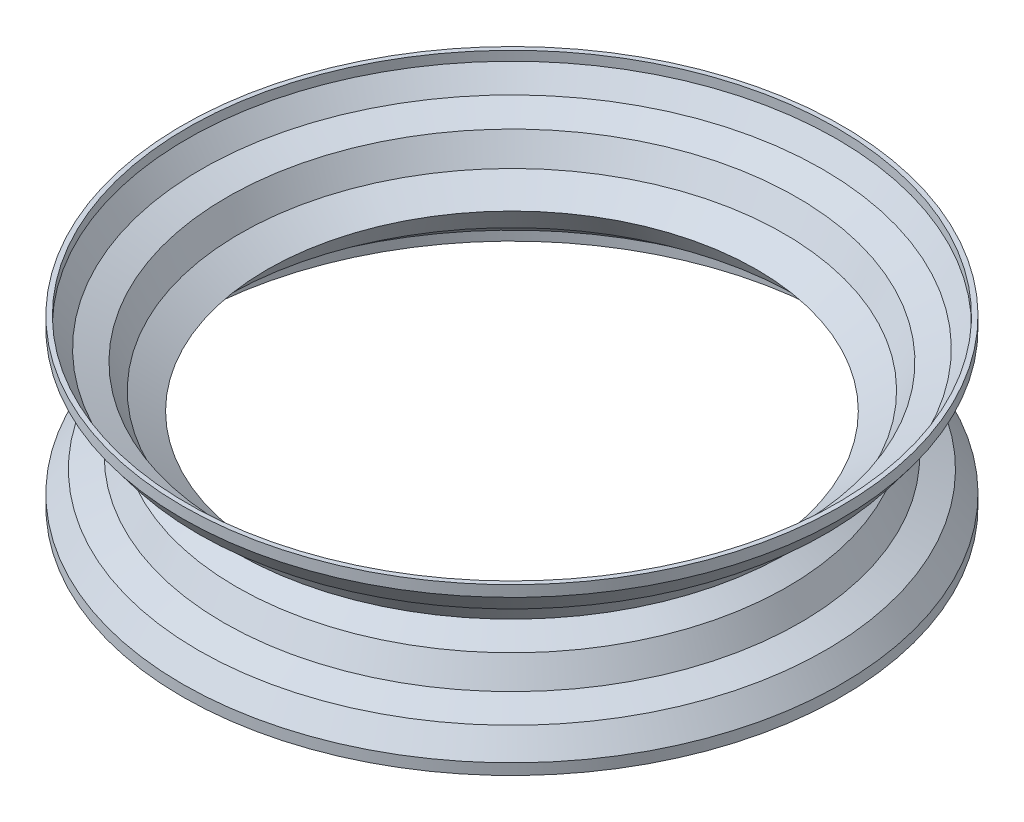
ISO-10303-21;
HEADER;
FILE_DESCRIPTION(('STEP AP214'),'2;1');
FILE_NAME('part.step','',(''),(''),'','','');
FILE_SCHEMA(('AUTOMOTIVE_DESIGN { 1 0 10303 214 1 1 1 1 }'));
ENDSEC;
DATA;
#1=APPLICATION_CONTEXT('core data for automotive mechanical design processes');
#2=APPLICATION_PROTOCOL_DEFINITION('international standard','automotive_design',2000,#1);
#3=PRODUCT_CONTEXT('',#1,'mechanical');
#4=PRODUCT('Part','Part','',(#3));
#5=PRODUCT_RELATED_PRODUCT_CATEGORY('part','',(#4));
#6=PRODUCT_DEFINITION_FORMATION('','',#4);
#7=PRODUCT_DEFINITION_CONTEXT('part definition',#1,'design');
#8=PRODUCT_DEFINITION('design','',#6,#7);
#9=PRODUCT_DEFINITION_SHAPE('','',#8);
#10=(LENGTH_UNIT() NAMED_UNIT(*) SI_UNIT(.MILLI.,.METRE.));
#11=(NAMED_UNIT(*) PLANE_ANGLE_UNIT() SI_UNIT($,.RADIAN.));
#12=(NAMED_UNIT(*) SI_UNIT($,.STERADIAN.) SOLID_ANGLE_UNIT());
#13=UNCERTAINTY_MEASURE_WITH_UNIT(LENGTH_MEASURE(1.E-05),#10,'distance_accuracy_value','');
#14=(GEOMETRIC_REPRESENTATION_CONTEXT(3) GLOBAL_UNCERTAINTY_ASSIGNED_CONTEXT((#13)) GLOBAL_UNIT_ASSIGNED_CONTEXT((#10,
#11,#12)) REPRESENTATION_CONTEXT('',''));
#15=CARTESIAN_POINT('',(0.,0.,0.));
#16=DIRECTION('',(0.,0.,1.));
#17=DIRECTION('',(1.,0.,0.));
#18=AXIS2_PLACEMENT_3D('',#15,#16,#17);
#19=CARTESIAN_POINT('',(0.,1.2,0.));
#20=DIRECTION('',(0.,-1.,0.));
#21=DIRECTION('',(0.,0.,-1.));
#22=AXIS2_PLACEMENT_3D('',#19,#20,#21);
#23=CYLINDRICAL_SURFACE('',#22,35.8938037049019);
#24=CARTESIAN_POINT('',(0.,1.2,0.));
#25=DIRECTION('',(0.,1.,0.));
#26=DIRECTION('',(0.,0.,1.));
#27=AXIS2_PLACEMENT_3D('',#24,#25,#26);
#28=CIRCLE('',#27,35.8938037049019);
#29=CARTESIAN_POINT('',(0.,1.2,35.8938037049019));
#30=VERTEX_POINT('',#29);
#31=EDGE_CURVE('E10',#30,#30,#28,.T.);
#32=ORIENTED_EDGE('',*,*,#31,.F.);
#33=EDGE_LOOP('',(#32));
#34=FACE_BOUND('',#33,.T.);
#35=CARTESIAN_POINT('',(0.,0.,0.));
#36=DIRECTION('',(0.,1.,0.));
#37=DIRECTION('',(0.,0.,1.));
#38=AXIS2_PLACEMENT_3D('',#35,#36,#37);
#39=CIRCLE('',#38,35.8938037049019);
#40=CARTESIAN_POINT('',(0.,0.,35.8938037049019));
#41=VERTEX_POINT('',#40);
#42=EDGE_CURVE('E40',#41,#41,#39,.T.);
#43=ORIENTED_EDGE('',*,*,#42,.T.);
#44=EDGE_LOOP('',(#43));
#45=FACE_BOUND('',#44,.T.);
#46=ADVANCED_FACE('F37',(#34,#45),#23,.T.);
#47=CARTESIAN_POINT('',(0.,0.,0.));
#48=DIRECTION('',(0.,1.,0.));
#49=DIRECTION('',(0.,0.,1.));
#50=AXIS2_PLACEMENT_3D('',#47,#48,#49);
#51=PLANE('',#50);
#52=CARTESIAN_POINT('',(0.,0.,0.));
#53=DIRECTION('',(0.,1.,0.));
#54=DIRECTION('',(0.,0.,1.));
#55=AXIS2_PLACEMENT_3D('',#52,#53,#54);
#56=CIRCLE('',#55,35.3938037049019);
#57=CARTESIAN_POINT('',(0.,0.,35.3938037049019));
#58=VERTEX_POINT('',#57);
#59=EDGE_CURVE('E93',#58,#58,#56,.T.);
#60=ORIENTED_EDGE('',*,*,#59,.T.);
#61=EDGE_LOOP('',(#60));
#62=FACE_BOUND('',#61,.T.);
#63=ORIENTED_EDGE('',*,*,#42,.F.);
#64=EDGE_LOOP('',(#63));
#65=FACE_BOUND('',#64,.T.);
#66=ADVANCED_FACE('F172',(#62,#65),#51,.F.);
#67=CARTESIAN_POINT('',(0.,3.51446172217943,0.));
#68=DIRECTION('',(0.,-1.,0.));
#69=DIRECTION('',(0.,0.,-1.));
#70=AXIS2_PLACEMENT_3D('',#67,#68,#69);
#71=CONICAL_SURFACE('',#70,34.1598368592887,0.642981197678177);
#72=ORIENTED_EDGE('',*,*,#31,.T.);
#73=EDGE_LOOP('',(#72));
#74=FACE_BOUND('',#73,.T.);
#75=CARTESIAN_POINT('',(0.,3.51446172217943,0.));
#76=DIRECTION('',(0.,1.,0.));
#77=DIRECTION('',(0.,0.,1.));
#78=AXIS2_PLACEMENT_3D('',#75,#76,#77);
#79=CIRCLE('',#78,34.1598368592887);
#80=CARTESIAN_POINT('',(0.,3.51446172217943,34.1598368592887));
#81=VERTEX_POINT('',#80);
#82=EDGE_CURVE('E49',#81,#81,#79,.T.);
#83=ORIENTED_EDGE('',*,*,#82,.F.);
#84=EDGE_LOOP('',(#83));
#85=FACE_BOUND('',#84,.T.);
#86=ADVANCED_FACE('F177',(#74,#85),#71,.T.);
#87=CARTESIAN_POINT('',(0.,4.73553827782057,0.));
#88=DIRECTION('',(0.,-1.,0.));
#89=DIRECTION('',(0.,0.,-1.));
#90=AXIS2_PLACEMENT_3D('',#87,#88,#89);
#91=CONICAL_SURFACE('',#90,31.3989771869434,1.15437979863592);
#92=ORIENTED_EDGE('',*,*,#82,.T.);
#93=EDGE_LOOP('',(#92));
#94=FACE_BOUND('',#93,.T.);
#95=CARTESIAN_POINT('',(0.,4.73553827782057,0.));
#96=DIRECTION('',(0.,1.,0.));
#97=DIRECTION('',(0.,0.,1.));
#98=AXIS2_PLACEMENT_3D('',#95,#96,#97);
#99=CIRCLE('',#98,31.3989771869434);
#100=CARTESIAN_POINT('',(0.,4.73553827782057,31.3989771869434));
#101=VERTEX_POINT('',#100);
#102=EDGE_CURVE('E54',#101,#101,#99,.T.);
#103=ORIENTED_EDGE('',*,*,#102,.F.);
#104=EDGE_LOOP('',(#103));
#105=FACE_BOUND('',#104,.T.);
#106=ADVANCED_FACE('F185',(#94,#105),#91,.T.);
#107=CARTESIAN_POINT('',(0.,7.41446172217942,0.));
#108=DIRECTION('',(0.,-1.,0.));
#109=DIRECTION('',(0.,0.,-1.));
#110=AXIS2_PLACEMENT_3D('',#107,#108,#109);
#111=CONICAL_SURFACE('',#110,30.0073079502409,0.47911637724037);
#112=ORIENTED_EDGE('',*,*,#102,.T.);
#113=EDGE_LOOP('',(#112));
#114=FACE_BOUND('',#113,.T.);
#115=CARTESIAN_POINT('',(0.,7.41446172217942,0.));
#116=DIRECTION('',(0.,1.,0.));
#117=DIRECTION('',(0.,0.,1.));
#118=AXIS2_PLACEMENT_3D('',#115,#116,#117);
#119=CIRCLE('',#118,30.0073079502409);
#120=CARTESIAN_POINT('',(0.,7.41446172217942,30.0073079502409));
#121=VERTEX_POINT('',#120);
#122=EDGE_CURVE('E58',#121,#121,#119,.T.);
#123=ORIENTED_EDGE('',*,*,#122,.F.);
#124=EDGE_LOOP('',(#123));
#125=FACE_BOUND('',#124,.T.);
#126=ADVANCED_FACE('F190',(#114,#125),#111,.T.);
#127=CARTESIAN_POINT('',(0.,9.,0.));
#128=DIRECTION('',(0.,-1.,0.));
#129=DIRECTION('',(0.,0.,-1.));
#130=AXIS2_PLACEMENT_3D('',#127,#128,#129);
#131=CONICAL_SURFACE('',#130,27.5887458868063,0.990514978198115);
#132=ORIENTED_EDGE('',*,*,#122,.T.);
#133=EDGE_LOOP('',(#132));
#134=FACE_BOUND('',#133,.T.);
#135=CARTESIAN_POINT('',(0.,9.,0.));
#136=DIRECTION('',(0.,1.,0.));
#137=DIRECTION('',(0.,0.,1.));
#138=AXIS2_PLACEMENT_3D('',#135,#136,#137);
#139=CIRCLE('',#138,27.5887458868063);
#140=CARTESIAN_POINT('',(0.,9.,27.5887458868063));
#141=VERTEX_POINT('',#140);
#142=EDGE_CURVE('E62',#141,#141,#139,.T.);
#143=ORIENTED_EDGE('',*,*,#142,.F.);
#144=EDGE_LOOP('',(#143));
#145=FACE_BOUND('',#144,.T.);
#146=ADVANCED_FACE('F194',(#134,#145),#131,.T.);
#147=CARTESIAN_POINT('',(0.,16.8,0.));
#148=DIRECTION('',(0.,1.,0.));
#149=DIRECTION('',(0.,0.,-1.));
#150=AXIS2_PLACEMENT_3D('',#147,#148,#149);
#151=CYLINDRICAL_SURFACE('',#150,35.8938037049019);
#152=CARTESIAN_POINT('',(0.,16.8,0.));
#153=DIRECTION('',(0.,1.,0.));
#154=DIRECTION('',(0.,0.,1.));
#155=AXIS2_PLACEMENT_3D('',#152,#153,#154);
#156=CIRCLE('',#155,35.8938037049019);
#157=CARTESIAN_POINT('',(0.,16.8,35.8938037049019));
#158=VERTEX_POINT('',#157);
#159=EDGE_CURVE('E66',#158,#158,#156,.T.);
#160=ORIENTED_EDGE('',*,*,#159,.T.);
#161=EDGE_LOOP('',(#160));
#162=FACE_BOUND('',#161,.T.);
#163=CARTESIAN_POINT('',(0.,18.,0.));
#164=DIRECTION('',(0.,1.,0.));
#165=DIRECTION('',(0.,0.,1.));
#166=AXIS2_PLACEMENT_3D('',#163,#164,#165);
#167=CIRCLE('',#166,35.8938037049019);
#168=CARTESIAN_POINT('',(0.,18.,35.8938037049019));
#169=VERTEX_POINT('',#168);
#170=EDGE_CURVE('E67',#169,#169,#167,.T.);
#171=ORIENTED_EDGE('',*,*,#170,.F.);
#172=EDGE_LOOP('',(#171));
#173=FACE_BOUND('',#172,.T.);
#174=ADVANCED_FACE('F198',(#162,#173),#151,.T.);
#175=CARTESIAN_POINT('',(0.,18.,0.));
#176=DIRECTION('',(0.,-1.,0.));
#177=DIRECTION('',(0.,0.,1.));
#178=AXIS2_PLACEMENT_3D('',#175,#176,#177);
#179=PLANE('',#178);
#180=CARTESIAN_POINT('',(0.,18.,0.));
#181=DIRECTION('',(0.,-1.,0.));
#182=DIRECTION('',(0.,0.,-1.));
#183=AXIS2_PLACEMENT_3D('',#180,#181,#182);
#184=CIRCLE('',#183,35.3938037049019);
#185=CARTESIAN_POINT('',(0.,18.,-35.3938037049019));
#186=VERTEX_POINT('',#185);
#187=EDGE_CURVE('E87',#186,#186,#184,.F.);
#188=ORIENTED_EDGE('',*,*,#187,.F.);
#189=EDGE_LOOP('',(#188));
#190=FACE_BOUND('',#189,.T.);
#191=ORIENTED_EDGE('',*,*,#170,.T.);
#192=EDGE_LOOP('',(#191));
#193=FACE_BOUND('',#192,.T.);
#194=ADVANCED_FACE('F202',(#190,#193),#179,.F.);
#195=CARTESIAN_POINT('',(0.,14.4855382778206,0.));
#196=DIRECTION('',(0.,1.,0.));
#197=DIRECTION('',(0.,0.,-1.));
#198=AXIS2_PLACEMENT_3D('',#195,#196,#197);
#199=CONICAL_SURFACE('',#198,34.1598368592887,0.642981197678177);
#200=ORIENTED_EDGE('',*,*,#159,.F.);
#201=EDGE_LOOP('',(#200));
#202=FACE_BOUND('',#201,.T.);
#203=CARTESIAN_POINT('',(0.,14.4855382778206,0.));
#204=DIRECTION('',(0.,1.,0.));
#205=DIRECTION('',(0.,0.,1.));
#206=AXIS2_PLACEMENT_3D('',#203,#204,#205);
#207=CIRCLE('',#206,34.1598368592887);
#208=CARTESIAN_POINT('',(0.,14.4855382778206,34.1598368592887));
#209=VERTEX_POINT('',#208);
#210=EDGE_CURVE('E71',#209,#209,#207,.T.);
#211=ORIENTED_EDGE('',*,*,#210,.T.);
#212=EDGE_LOOP('',(#211));
#213=FACE_BOUND('',#212,.T.);
#214=ADVANCED_FACE('F206',(#202,#213),#199,.T.);
#215=CARTESIAN_POINT('',(0.,13.2644617221794,0.));
#216=DIRECTION('',(0.,1.,0.));
#217=DIRECTION('',(0.,0.,-1.));
#218=AXIS2_PLACEMENT_3D('',#215,#216,#217);
#219=CONICAL_SURFACE('',#218,31.3989771869434,1.15437979863592);
#220=ORIENTED_EDGE('',*,*,#210,.F.);
#221=EDGE_LOOP('',(#220));
#222=FACE_BOUND('',#221,.T.);
#223=CARTESIAN_POINT('',(0.,13.2644617221794,0.));
#224=DIRECTION('',(0.,1.,0.));
#225=DIRECTION('',(0.,0.,1.));
#226=AXIS2_PLACEMENT_3D('',#223,#224,#225);
#227=CIRCLE('',#226,31.3989771869434);
#228=CARTESIAN_POINT('',(0.,13.2644617221794,31.3989771869434));
#229=VERTEX_POINT('',#228);
#230=EDGE_CURVE('E78',#229,#229,#227,.T.);
#231=ORIENTED_EDGE('',*,*,#230,.T.);
#232=EDGE_LOOP('',(#231));
#233=FACE_BOUND('',#232,.T.);
#234=ADVANCED_FACE('F210',(#222,#233),#219,.T.);
#235=CARTESIAN_POINT('',(0.,10.5855382778206,0.));
#236=DIRECTION('',(0.,1.,0.));
#237=DIRECTION('',(0.,0.,-1.));
#238=AXIS2_PLACEMENT_3D('',#235,#236,#237);
#239=CONICAL_SURFACE('',#238,30.0073079502409,0.47911637724037);
#240=ORIENTED_EDGE('',*,*,#230,.F.);
#241=EDGE_LOOP('',(#240));
#242=FACE_BOUND('',#241,.T.);
#243=CARTESIAN_POINT('',(0.,10.5855382778206,0.));
#244=DIRECTION('',(0.,1.,0.));
#245=DIRECTION('',(0.,0.,1.));
#246=AXIS2_PLACEMENT_3D('',#243,#244,#245);
#247=CIRCLE('',#246,30.0073079502409);
#248=CARTESIAN_POINT('',(0.,10.5855382778206,30.0073079502409));
#249=VERTEX_POINT('',#248);
#250=EDGE_CURVE('E82',#249,#249,#247,.T.);
#251=ORIENTED_EDGE('',*,*,#250,.T.);
#252=EDGE_LOOP('',(#251));
#253=FACE_BOUND('',#252,.T.);
#254=ADVANCED_FACE('F214',(#242,#253),#239,.T.);
#255=CARTESIAN_POINT('',(0.,9.,0.));
#256=DIRECTION('',(0.,1.,0.));
#257=DIRECTION('',(0.,0.,-1.));
#258=AXIS2_PLACEMENT_3D('',#255,#256,#257);
#259=CONICAL_SURFACE('',#258,27.5887458868063,0.990514978198115);
#260=ORIENTED_EDGE('',*,*,#250,.F.);
#261=EDGE_LOOP('',(#260));
#262=FACE_BOUND('',#261,.T.);
#263=ORIENTED_EDGE('',*,*,#142,.T.);
#264=EDGE_LOOP('',(#263));
#265=FACE_BOUND('',#264,.T.);
#266=ADVANCED_FACE('F217',(#262,#265),#259,.T.);
#267=CARTESIAN_POINT('',(0.,1.2,0.));
#268=DIRECTION('',(0.,-1.,0.));
#269=DIRECTION('',(0.,0.,-1.));
#270=AXIS2_PLACEMENT_3D('',#267,#268,#269);
#271=CYLINDRICAL_SURFACE('',#270,35.3938037049019);
#272=CARTESIAN_POINT('',(0.,1.03347774057762,0.));
#273=DIRECTION('',(0.,-1.,0.));
#274=DIRECTION('',(0.,0.,-1.));
#275=AXIS2_PLACEMENT_3D('',#272,#273,#274);
#276=CIRCLE('',#275,35.3938037049019);
#277=CARTESIAN_POINT('',(0.,1.03347774057762,-35.3938037049019));
#278=VERTEX_POINT('',#277);
#279=EDGE_CURVE('E86',#278,#278,#276,.F.);
#280=ORIENTED_EDGE('',*,*,#279,.T.);
#281=EDGE_LOOP('',(#280));
#282=FACE_BOUND('',#281,.T.);
#283=ORIENTED_EDGE('',*,*,#59,.F.);
#284=EDGE_LOOP('',(#283));
#285=FACE_BOUND('',#284,.T.);
#286=ADVANCED_FACE('F131',(#282,#285),#271,.F.);
#287=CARTESIAN_POINT('',(0.,3.21466972716224,0.));
#288=DIRECTION('',(0.,-1.,0.));
#289=DIRECTION('',(0.,0.,-1.));
#290=AXIS2_PLACEMENT_3D('',#287,#288,#289);
#291=CONICAL_SURFACE('',#290,33.7596809400227,0.642981197678177);
#292=ORIENTED_EDGE('',*,*,#279,.F.);
#293=EDGE_LOOP('',(#292));
#294=FACE_BOUND('',#293,.T.);
#295=CARTESIAN_POINT('',(0.,3.11006027575374,0.));
#296=DIRECTION('',(0.,1.,0.));
#297=DIRECTION('',(0.,0.,1.));
#298=AXIS2_PLACEMENT_3D('',#295,#296,#297);
#299=CIRCLE('',#298,33.8380530810445);
#300=CARTESIAN_POINT('',(0.,3.11006027575374,33.8380530810445));
#301=VERTEX_POINT('',#300);
#302=EDGE_CURVE('E97',#301,#301,#299,.T.);
#303=ORIENTED_EDGE('',*,*,#302,.T.);
#304=EDGE_LOOP('',(#303));
#305=FACE_BOUND('',#304,.T.);
#306=ADVANCED_FACE('F134',(#294,#305),#291,.F.);
#307=CARTESIAN_POINT('',(0.,4.27826614147971,0.));
#308=DIRECTION('',(0.,-1.,0.));
#309=DIRECTION('',(0.,0.,-1.));
#310=AXIS2_PLACEMENT_3D('',#307,#308,#309);
#311=CONICAL_SURFACE('',#310,31.1967342802043,1.15437979863592);
#312=ORIENTED_EDGE('',*,*,#302,.F.);
#313=EDGE_LOOP('',(#312));
#314=FACE_BOUND('',#313,.T.);
#315=CARTESIAN_POINT('',(0.,4.34926846291144,0.));
#316=DIRECTION('',(0.,1.,0.));
#317=DIRECTION('',(0.,0.,1.));
#318=AXIS2_PLACEMENT_3D('',#315,#316,#317);
#319=CIRCLE('',#318,31.0361977069828);
#320=CARTESIAN_POINT('',(0.,4.34926846291144,31.0361977069828));
#321=VERTEX_POINT('',#320);
#322=EDGE_CURVE('E120',#321,#321,#319,.T.);
#323=ORIENTED_EDGE('',*,*,#322,.T.);
#324=EDGE_LOOP('',(#323));
#325=FACE_BOUND('',#324,.T.);
#326=ADVANCED_FACE('F137',(#314,#325),#311,.F.);
#327=CARTESIAN_POINT('',(0.,7.18396410894645,0.));
#328=DIRECTION('',(0.,-1.,0.));
#329=DIRECTION('',(0.,0.,-1.));
#330=AXIS2_PLACEMENT_3D('',#327,#328,#329);
#331=CONICAL_SURFACE('',#330,29.5636066427221,0.47911637724037);
#332=ORIENTED_EDGE('',*,*,#322,.F.);
#333=EDGE_LOOP('',(#332));
#334=FACE_BOUND('',#333,.T.);
#335=CARTESIAN_POINT('',(0.,7.06797094694621,0.));
#336=DIRECTION('',(0.,1.,0.));
#337=DIRECTION('',(0.,0.,1.));
#338=AXIS2_PLACEMENT_3D('',#335,#336,#337);
#339=CIRCLE('',#338,29.6238637267995);
#340=CARTESIAN_POINT('',(0.,7.06797094694621,29.6238637267995));
#341=VERTEX_POINT('',#340);
#342=EDGE_CURVE('E116',#341,#341,#339,.T.);
#343=ORIENTED_EDGE('',*,*,#342,.T.);
#344=EDGE_LOOP('',(#343));
#345=FACE_BOUND('',#344,.T.);
#346=ADVANCED_FACE('F143',(#334,#345),#331,.F.);
#347=CARTESIAN_POINT('',(0.,8.58184578447717,0.));
#348=DIRECTION('',(0.,-1.,0.));
#349=DIRECTION('',(0.,0.,-1.));
#350=AXIS2_PLACEMENT_3D('',#347,#348,#349);
#351=CONICAL_SURFACE('',#350,27.3146162604605,0.990514978198115);
#352=ORIENTED_EDGE('',*,*,#342,.F.);
#353=EDGE_LOOP('',(#352));
#354=FACE_BOUND('',#353,.T.);
#355=CARTESIAN_POINT('',(0.,9.,0.));
#356=DIRECTION('',(0.,1.,0.));
#357=DIRECTION('',(0.,0.,1.));
#358=AXIS2_PLACEMENT_3D('',#355,#356,#357);
#359=CIRCLE('',#358,26.6767685739833);
#360=CARTESIAN_POINT('',(0.,9.,26.6767685739833));
#361=VERTEX_POINT('',#360);
#362=EDGE_CURVE('E101',#361,#361,#359,.T.);
#363=ORIENTED_EDGE('',*,*,#362,.T.);
#364=EDGE_LOOP('',(#363));
#365=FACE_BOUND('',#364,.T.);
#366=ADVANCED_FACE('F149',(#354,#365),#351,.F.);
#367=CARTESIAN_POINT('',(0.,16.8,0.));
#368=DIRECTION('',(0.,1.,0.));
#369=DIRECTION('',(0.,0.,-1.));
#370=AXIS2_PLACEMENT_3D('',#367,#368,#369);
#371=CYLINDRICAL_SURFACE('',#370,35.3938037049019);
#372=CARTESIAN_POINT('',(0.,16.9665222594224,0.));
#373=DIRECTION('',(0.,1.,0.));
#374=DIRECTION('',(0.,0.,1.));
#375=AXIS2_PLACEMENT_3D('',#372,#373,#374);
#376=CIRCLE('',#375,35.3938037049019);
#377=CARTESIAN_POINT('',(0.,16.9665222594224,35.3938037049019));
#378=VERTEX_POINT('',#377);
#379=EDGE_CURVE('E91',#378,#378,#376,.T.);
#380=ORIENTED_EDGE('',*,*,#379,.F.);
#381=EDGE_LOOP('',(#380));
#382=FACE_BOUND('',#381,.T.);
#383=ORIENTED_EDGE('',*,*,#187,.T.);
#384=EDGE_LOOP('',(#383));
#385=FACE_BOUND('',#384,.T.);
#386=ADVANCED_FACE('F155',(#382,#385),#371,.F.);
#387=CARTESIAN_POINT('',(0.,14.7853302728378,0.));
#388=DIRECTION('',(0.,1.,0.));
#389=DIRECTION('',(0.,0.,-1.));
#390=AXIS2_PLACEMENT_3D('',#387,#388,#389);
#391=CONICAL_SURFACE('',#390,33.7596809400227,0.642981197678177);
#392=ORIENTED_EDGE('',*,*,#379,.T.);
#393=EDGE_LOOP('',(#392));
#394=FACE_BOUND('',#393,.T.);
#395=CARTESIAN_POINT('',(0.,14.8899397242463,0.));
#396=DIRECTION('',(0.,1.,0.));
#397=DIRECTION('',(0.,0.,1.));
#398=AXIS2_PLACEMENT_3D('',#395,#396,#397);
#399=CIRCLE('',#398,33.8380530810445);
#400=CARTESIAN_POINT('',(0.,14.8899397242463,33.8380530810445));
#401=VERTEX_POINT('',#400);
#402=EDGE_CURVE('E92',#401,#401,#399,.T.);
#403=ORIENTED_EDGE('',*,*,#402,.F.);
#404=EDGE_LOOP('',(#403));
#405=FACE_BOUND('',#404,.T.);
#406=ADVANCED_FACE('F235',(#394,#405),#391,.F.);
#407=CARTESIAN_POINT('',(0.,13.7217338585203,0.));
#408=DIRECTION('',(0.,1.,0.));
#409=DIRECTION('',(0.,0.,-1.));
#410=AXIS2_PLACEMENT_3D('',#407,#408,#409);
#411=CONICAL_SURFACE('',#410,31.1967342802043,1.15437979863592);
#412=ORIENTED_EDGE('',*,*,#402,.T.);
#413=EDGE_LOOP('',(#412));
#414=FACE_BOUND('',#413,.T.);
#415=CARTESIAN_POINT('',(0.,13.6507315370886,0.));
#416=DIRECTION('',(0.,1.,0.));
#417=DIRECTION('',(0.,0.,1.));
#418=AXIS2_PLACEMENT_3D('',#415,#416,#417);
#419=CIRCLE('',#418,31.0361977069828);
#420=CARTESIAN_POINT('',(0.,13.6507315370886,31.0361977069828));
#421=VERTEX_POINT('',#420);
#422=EDGE_CURVE('E105',#421,#421,#419,.T.);
#423=ORIENTED_EDGE('',*,*,#422,.F.);
#424=EDGE_LOOP('',(#423));
#425=FACE_BOUND('',#424,.T.);
#426=ADVANCED_FACE('F167',(#414,#425),#411,.F.);
#427=CARTESIAN_POINT('',(0.,10.8160358910536,0.));
#428=DIRECTION('',(0.,1.,0.));
#429=DIRECTION('',(0.,0.,-1.));
#430=AXIS2_PLACEMENT_3D('',#427,#428,#429);
#431=CONICAL_SURFACE('',#430,29.5636066427221,0.47911637724037);
#432=ORIENTED_EDGE('',*,*,#422,.T.);
#433=EDGE_LOOP('',(#432));
#434=FACE_BOUND('',#433,.T.);
#435=CARTESIAN_POINT('',(0.,10.9320290530538,0.));
#436=DIRECTION('',(0.,1.,0.));
#437=DIRECTION('',(0.,0.,1.));
#438=AXIS2_PLACEMENT_3D('',#435,#436,#437);
#439=CIRCLE('',#438,29.6238637267995);
#440=CARTESIAN_POINT('',(0.,10.9320290530538,29.6238637267995));
#441=VERTEX_POINT('',#440);
#442=EDGE_CURVE('E109',#441,#441,#439,.T.);
#443=ORIENTED_EDGE('',*,*,#442,.F.);
#444=EDGE_LOOP('',(#443));
#445=FACE_BOUND('',#444,.T.);
#446=ADVANCED_FACE('F161',(#434,#445),#431,.F.);
#447=CARTESIAN_POINT('',(0.,9.41815421552283,0.));
#448=DIRECTION('',(0.,1.,0.));
#449=DIRECTION('',(0.,0.,-1.));
#450=AXIS2_PLACEMENT_3D('',#447,#448,#449);
#451=CONICAL_SURFACE('',#450,27.3146162604605,0.990514978198115);
#452=ORIENTED_EDGE('',*,*,#442,.T.);
#453=EDGE_LOOP('',(#452));
#454=FACE_BOUND('',#453,.T.);
#455=ORIENTED_EDGE('',*,*,#362,.F.);
#456=EDGE_LOOP('',(#455));
#457=FACE_BOUND('',#456,.T.);
#458=ADVANCED_FACE('F159',(#454,#457),#451,.F.);
#459=CLOSED_SHELL('',(#46,#66,#86,#106,#126,#146,#174,#194,#214,#234,#254,#266,#286,#306,#326,
#346,#366,#386,#406,#426,#446,#458));
#460=MANIFOLD_SOLID_BREP('B2',#459);
#461=ADVANCED_BREP_SHAPE_REPRESENTATION('',(#18,#460),#14);
#462=SHAPE_DEFINITION_REPRESENTATION(#9,#461);
ENDSEC;
END-ISO-10303-21;
